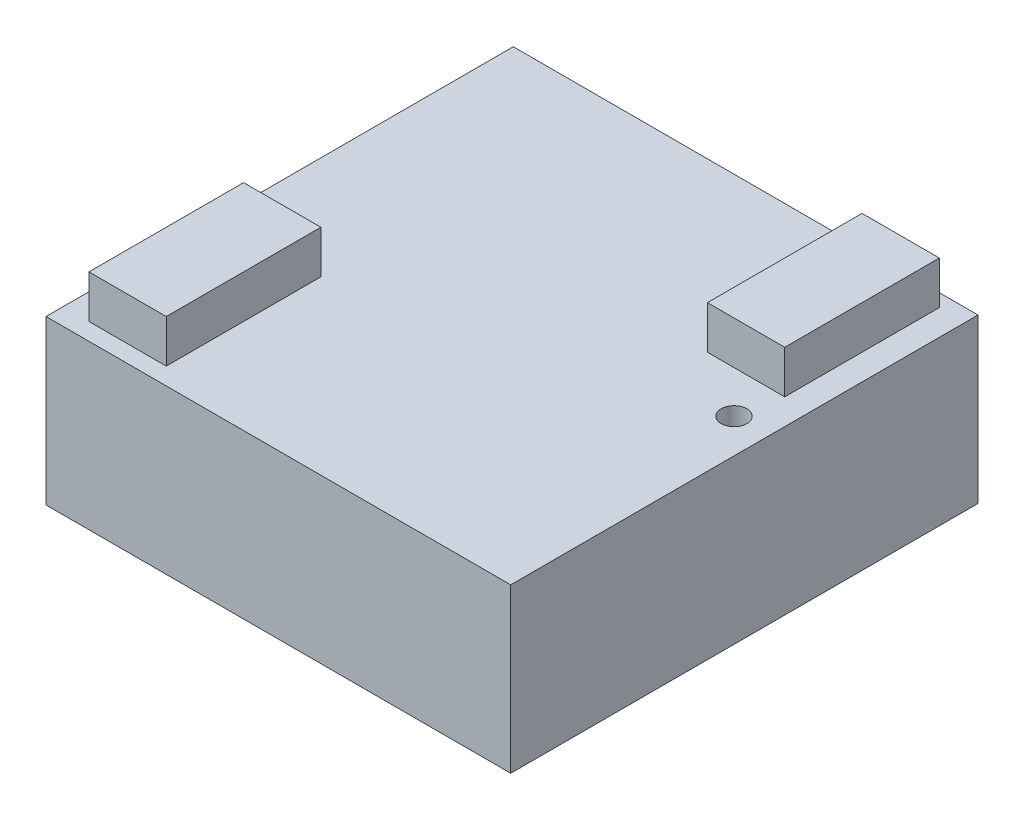
ISO-10303-21;
HEADER;
FILE_DESCRIPTION(('STEP AP214'),'2;1');
FILE_NAME('part.step','',(''),(''),'','','');
FILE_SCHEMA(('AUTOMOTIVE_DESIGN { 1 0 10303 214 1 1 1 1 }'));
ENDSEC;
DATA;
#1=APPLICATION_CONTEXT('core data for automotive mechanical design processes');
#2=APPLICATION_PROTOCOL_DEFINITION('international standard','automotive_design',2000,#1);
#3=PRODUCT_CONTEXT('',#1,'mechanical');
#4=PRODUCT('Part','Part','',(#3));
#5=PRODUCT_RELATED_PRODUCT_CATEGORY('part','',(#4));
#6=PRODUCT_DEFINITION_FORMATION('','',#4);
#7=PRODUCT_DEFINITION_CONTEXT('part definition',#1,'design');
#8=PRODUCT_DEFINITION('design','',#6,#7);
#9=PRODUCT_DEFINITION_SHAPE('','',#8);
#10=(LENGTH_UNIT() NAMED_UNIT(*) SI_UNIT(.MILLI.,.METRE.));
#11=(NAMED_UNIT(*) PLANE_ANGLE_UNIT() SI_UNIT($,.RADIAN.));
#12=(NAMED_UNIT(*) SI_UNIT($,.STERADIAN.) SOLID_ANGLE_UNIT());
#13=UNCERTAINTY_MEASURE_WITH_UNIT(LENGTH_MEASURE(1.E-05),#10,'distance_accuracy_value','');
#14=(GEOMETRIC_REPRESENTATION_CONTEXT(3) GLOBAL_UNCERTAINTY_ASSIGNED_CONTEXT((#13)) GLOBAL_UNIT_ASSIGNED_CONTEXT((#10,
#11,#12)) REPRESENTATION_CONTEXT('',''));
#15=CARTESIAN_POINT('',(0.,0.,0.));
#16=DIRECTION('',(0.,0.,1.));
#17=DIRECTION('',(1.,0.,0.));
#18=AXIS2_PLACEMENT_3D('',#15,#16,#17);
#19=CARTESIAN_POINT('',(0.,19.,0.));
#20=DIRECTION('',(0.,-1.,0.));
#21=DIRECTION('',(0.,0.,-1.));
#22=AXIS2_PLACEMENT_3D('',#19,#20,#21);
#23=PLANE('',#22);
#24=CARTESIAN_POINT('',(50.1,19.,-30.));
#25=DIRECTION('',(0.,-1.,0.));
#26=DIRECTION('',(0.,0.,-1.));
#27=AXIS2_PLACEMENT_3D('',#24,#25,#26);
#28=CIRCLE('',#27,1.5);
#29=CARTESIAN_POINT('',(50.1,19.,-31.5));
#30=VERTEX_POINT('',#29);
#31=EDGE_CURVE('E380',#30,#30,#28,.T.);
#32=ORIENTED_EDGE('',*,*,#31,.T.);
#33=EDGE_LOOP('',(#32));
#34=FACE_BOUND('',#33,.T.);
#35=DIRECTION('',(0.,0.,1.));
#36=VECTOR('',#35,1.);
#37=CARTESIAN_POINT('',(42.1,19.,-52.9));
#38=LINE('',#37,#36);
#39=CARTESIAN_POINT('',(42.1,19.,-52.9));
#40=VERTEX_POINT('',#39);
#41=CARTESIAN_POINT('',(42.1,19.,-34.9));
#42=VERTEX_POINT('',#41);
#43=EDGE_CURVE('E168',#40,#42,#38,.T.);
#44=ORIENTED_EDGE('',*,*,#43,.F.);
#45=DIRECTION('',(-1.,0.,0.));
#46=VECTOR('',#45,1.);
#47=CARTESIAN_POINT('',(42.1,19.,-52.9));
#48=LINE('',#47,#46);
#49=CARTESIAN_POINT('',(51.1,19.,-52.9));
#50=VERTEX_POINT('',#49);
#51=EDGE_CURVE('E181',#50,#40,#48,.T.);
#52=ORIENTED_EDGE('',*,*,#51,.F.);
#53=DIRECTION('',(0.,0.,-1.));
#54=VECTOR('',#53,1.);
#55=CARTESIAN_POINT('',(51.1,19.,-52.9));
#56=LINE('',#55,#54);
#57=CARTESIAN_POINT('',(51.1,19.,-34.9));
#58=VERTEX_POINT('',#57);
#59=EDGE_CURVE('E190',#58,#50,#56,.T.);
#60=ORIENTED_EDGE('',*,*,#59,.F.);
#61=DIRECTION('',(1.,0.,0.));
#62=VECTOR('',#61,1.);
#63=CARTESIAN_POINT('',(42.1,19.,-34.9));
#64=LINE('',#63,#62);
#65=EDGE_CURVE('E171',#42,#58,#64,.T.);
#66=ORIENTED_EDGE('',*,*,#65,.F.);
#67=EDGE_LOOP('',(#44,#52,#60,#66));
#68=FACE_BOUND('',#67,.T.);
#69=DIRECTION('',(0.,0.,1.));
#70=VECTOR('',#69,1.);
#71=CARTESIAN_POINT('',(0.,19.,0.));
#72=LINE('',#71,#70);
#73=CARTESIAN_POINT('',(0.,19.,-54.4));
#74=VERTEX_POINT('',#73);
#75=CARTESIAN_POINT('',(0.,19.,0.));
#76=VERTEX_POINT('',#75);
#77=EDGE_CURVE('E236',#74,#76,#72,.T.);
#78=ORIENTED_EDGE('',*,*,#77,.T.);
#79=DIRECTION('',(1.,0.,0.));
#80=VECTOR('',#79,1.);
#81=CARTESIAN_POINT('',(0.,19.,0.));
#82=LINE('',#81,#80);
#83=CARTESIAN_POINT('',(54.1,19.,0.));
#84=VERTEX_POINT('',#83);
#85=EDGE_CURVE('E239',#76,#84,#82,.T.);
#86=ORIENTED_EDGE('',*,*,#85,.T.);
#87=DIRECTION('',(0.,0.,-1.));
#88=VECTOR('',#87,1.);
#89=CARTESIAN_POINT('',(54.1,19.,0.));
#90=LINE('',#89,#88);
#91=CARTESIAN_POINT('',(54.1,19.,-54.4));
#92=VERTEX_POINT('',#91);
#93=EDGE_CURVE('E242',#84,#92,#90,.T.);
#94=ORIENTED_EDGE('',*,*,#93,.T.);
#95=DIRECTION('',(-1.,0.,0.));
#96=VECTOR('',#95,1.);
#97=CARTESIAN_POINT('',(0.,19.,-54.4));
#98=LINE('',#97,#96);
#99=EDGE_CURVE('E244',#92,#74,#98,.T.);
#100=ORIENTED_EDGE('',*,*,#99,.T.);
#101=EDGE_LOOP('',(#78,#86,#94,#100));
#102=FACE_BOUND('',#101,.T.);
#103=DIRECTION('',(0.,0.,1.));
#104=VECTOR('',#103,1.);
#105=CARTESIAN_POINT('',(3.,19.,-20.));
#106=LINE('',#105,#104);
#107=CARTESIAN_POINT('',(3.,19.,-20.));
#108=VERTEX_POINT('',#107);
#109=CARTESIAN_POINT('',(3.,19.,-2.));
#110=VERTEX_POINT('',#109);
#111=EDGE_CURVE('E167',#108,#110,#106,.T.);
#112=ORIENTED_EDGE('',*,*,#111,.F.);
#113=DIRECTION('',(-1.,0.,0.));
#114=VECTOR('',#113,1.);
#115=CARTESIAN_POINT('',(3.,19.,-20.));
#116=LINE('',#115,#114);
#117=CARTESIAN_POINT('',(12.,19.,-20.));
#118=VERTEX_POINT('',#117);
#119=EDGE_CURVE('E164',#118,#108,#116,.T.);
#120=ORIENTED_EDGE('',*,*,#119,.F.);
#121=DIRECTION('',(0.,0.,-1.));
#122=VECTOR('',#121,1.);
#123=CARTESIAN_POINT('',(12.,19.,-20.));
#124=LINE('',#123,#122);
#125=CARTESIAN_POINT('',(12.,19.,-2.));
#126=VERTEX_POINT('',#125);
#127=EDGE_CURVE('E54',#126,#118,#124,.T.);
#128=ORIENTED_EDGE('',*,*,#127,.F.);
#129=DIRECTION('',(1.,0.,0.));
#130=VECTOR('',#129,1.);
#131=CARTESIAN_POINT('',(3.,19.,-2.));
#132=LINE('',#131,#130);
#133=EDGE_CURVE('E49',#110,#126,#132,.T.);
#134=ORIENTED_EDGE('',*,*,#133,.F.);
#135=EDGE_LOOP('',(#112,#120,#128,#134));
#136=FACE_BOUND('',#135,.T.);
#137=ADVANCED_FACE('F34',(#34,#68,#102,#136),#23,.F.);
#138=CARTESIAN_POINT('',(0.,0.,0.));
#139=DIRECTION('',(0.,-1.,0.));
#140=DIRECTION('',(0.,0.,-1.));
#141=AXIS2_PLACEMENT_3D('',#138,#139,#140);
#142=PLANE('',#141);
#143=CARTESIAN_POINT('',(50.1,0.,-30.));
#144=DIRECTION('',(0.,-1.,0.));
#145=DIRECTION('',(0.,0.,-1.));
#146=AXIS2_PLACEMENT_3D('',#143,#144,#145);
#147=CIRCLE('',#146,1.5);
#148=CARTESIAN_POINT('',(50.1,0.,-31.5));
#149=VERTEX_POINT('',#148);
#150=EDGE_CURVE('E378',#149,#149,#147,.T.);
#151=ORIENTED_EDGE('',*,*,#150,.F.);
#152=EDGE_LOOP('',(#151));
#153=FACE_BOUND('',#152,.T.);
#154=DIRECTION('',(0.,0.,1.));
#155=VECTOR('',#154,1.);
#156=CARTESIAN_POINT('',(0.,0.,0.));
#157=LINE('',#156,#155);
#158=CARTESIAN_POINT('',(0.,0.,-54.4));
#159=VERTEX_POINT('',#158);
#160=CARTESIAN_POINT('',(0.,0.,0.));
#161=VERTEX_POINT('',#160);
#162=EDGE_CURVE('E235',#159,#161,#157,.T.);
#163=ORIENTED_EDGE('',*,*,#162,.F.);
#164=DIRECTION('',(-1.,0.,0.));
#165=VECTOR('',#164,1.);
#166=CARTESIAN_POINT('',(0.,0.,-54.4));
#167=LINE('',#166,#165);
#168=CARTESIAN_POINT('',(54.1,0.,-54.4));
#169=VERTEX_POINT('',#168);
#170=EDGE_CURVE('E240',#169,#159,#167,.T.);
#171=ORIENTED_EDGE('',*,*,#170,.F.);
#172=DIRECTION('',(0.,0.,-1.));
#173=VECTOR('',#172,1.);
#174=CARTESIAN_POINT('',(54.1,0.,0.));
#175=LINE('',#174,#173);
#176=CARTESIAN_POINT('',(54.1,0.,0.));
#177=VERTEX_POINT('',#176);
#178=EDGE_CURVE('E251',#177,#169,#175,.T.);
#179=ORIENTED_EDGE('',*,*,#178,.F.);
#180=DIRECTION('',(1.,0.,0.));
#181=VECTOR('',#180,1.);
#182=CARTESIAN_POINT('',(0.,0.,0.));
#183=LINE('',#182,#181);
#184=EDGE_CURVE('E249',#161,#177,#183,.T.);
#185=ORIENTED_EDGE('',*,*,#184,.F.);
#186=EDGE_LOOP('',(#163,#171,#179,#185));
#187=FACE_BOUND('',#186,.T.);
#188=DIRECTION('',(1.,0.,0.));
#189=VECTOR('',#188,1.);
#190=CARTESIAN_POINT('',(17.,0.,-34.4));
#191=LINE('',#190,#189);
#192=CARTESIAN_POINT('',(17.,0.,-34.4));
#193=VERTEX_POINT('',#192);
#194=CARTESIAN_POINT('',(37.,0.,-34.4));
#195=VERTEX_POINT('',#194);
#196=EDGE_CURVE('E220',#193,#195,#191,.T.);
#197=ORIENTED_EDGE('',*,*,#196,.F.);
#198=DIRECTION('',(0.,0.,-1.));
#199=VECTOR('',#198,1.);
#200=CARTESIAN_POINT('',(17.,0.,-34.4));
#201=LINE('',#200,#199);
#202=CARTESIAN_POINT('',(17.,0.,-22.4));
#203=VERTEX_POINT('',#202);
#204=EDGE_CURVE('E206',#203,#193,#201,.T.);
#205=ORIENTED_EDGE('',*,*,#204,.F.);
#206=DIRECTION('',(-1.,0.,0.));
#207=VECTOR('',#206,1.);
#208=CARTESIAN_POINT('',(17.,0.,-22.4));
#209=LINE('',#208,#207);
#210=CARTESIAN_POINT('',(37.,0.,-22.4));
#211=VERTEX_POINT('',#210);
#212=EDGE_CURVE('E211',#211,#203,#209,.T.);
#213=ORIENTED_EDGE('',*,*,#212,.F.);
#214=DIRECTION('',(0.,0.,1.));
#215=VECTOR('',#214,1.);
#216=CARTESIAN_POINT('',(37.,0.,-34.4));
#217=LINE('',#216,#215);
#218=EDGE_CURVE('E222',#195,#211,#217,.T.);
#219=ORIENTED_EDGE('',*,*,#218,.F.);
#220=EDGE_LOOP('',(#197,#205,#213,#219));
#221=FACE_BOUND('',#220,.T.);
#222=ADVANCED_FACE('F269',(#153,#187,#221),#142,.T.);
#223=CARTESIAN_POINT('',(0.,19.,0.));
#224=DIRECTION('',(1.,0.,0.));
#225=DIRECTION('',(0.,0.,-1.));
#226=AXIS2_PLACEMENT_3D('',#223,#224,#225);
#227=PLANE('',#226);
#228=ORIENTED_EDGE('',*,*,#162,.T.);
#229=DIRECTION('',(0.,-1.,0.));
#230=VECTOR('',#229,1.);
#231=CARTESIAN_POINT('',(0.,19.,0.));
#232=LINE('',#231,#230);
#233=EDGE_CURVE('E11',#76,#161,#232,.T.);
#234=ORIENTED_EDGE('',*,*,#233,.F.);
#235=ORIENTED_EDGE('',*,*,#77,.F.);
#236=DIRECTION('',(0.,-1.,0.));
#237=VECTOR('',#236,1.);
#238=CARTESIAN_POINT('',(0.,19.,-54.4));
#239=LINE('',#238,#237);
#240=EDGE_CURVE('E246',#74,#159,#239,.T.);
#241=ORIENTED_EDGE('',*,*,#240,.T.);
#242=EDGE_LOOP('',(#228,#234,#235,#241));
#243=FACE_BOUND('',#242,.T.);
#244=ADVANCED_FACE('F36',(#243),#227,.F.);
#245=CARTESIAN_POINT('',(0.,19.,0.));
#246=DIRECTION('',(0.,0.,-1.));
#247=DIRECTION('',(-1.,0.,0.));
#248=AXIS2_PLACEMENT_3D('',#245,#246,#247);
#249=PLANE('',#248);
#250=ORIENTED_EDGE('',*,*,#184,.T.);
#251=DIRECTION('',(0.,-1.,0.));
#252=VECTOR('',#251,1.);
#253=CARTESIAN_POINT('',(54.1,19.,0.));
#254=LINE('',#253,#252);
#255=EDGE_CURVE('E42',#84,#177,#254,.T.);
#256=ORIENTED_EDGE('',*,*,#255,.F.);
#257=ORIENTED_EDGE('',*,*,#85,.F.);
#258=ORIENTED_EDGE('',*,*,#233,.T.);
#259=EDGE_LOOP('',(#250,#256,#257,#258));
#260=FACE_BOUND('',#259,.T.);
#261=ADVANCED_FACE('F279',(#260),#249,.F.);
#262=CARTESIAN_POINT('',(54.1,19.,0.));
#263=DIRECTION('',(-1.,0.,0.));
#264=DIRECTION('',(0.,0.,1.));
#265=AXIS2_PLACEMENT_3D('',#262,#263,#264);
#266=PLANE('',#265);
#267=ORIENTED_EDGE('',*,*,#178,.T.);
#268=DIRECTION('',(0.,-1.,0.));
#269=VECTOR('',#268,1.);
#270=CARTESIAN_POINT('',(54.1,19.,-54.4));
#271=LINE('',#270,#269);
#272=EDGE_CURVE('E256',#92,#169,#271,.T.);
#273=ORIENTED_EDGE('',*,*,#272,.F.);
#274=ORIENTED_EDGE('',*,*,#93,.F.);
#275=ORIENTED_EDGE('',*,*,#255,.T.);
#276=EDGE_LOOP('',(#267,#273,#274,#275));
#277=FACE_BOUND('',#276,.T.);
#278=ADVANCED_FACE('F263',(#277),#266,.F.);
#279=CARTESIAN_POINT('',(0.,19.,-54.4));
#280=DIRECTION('',(0.,0.,1.));
#281=DIRECTION('',(1.,0.,0.));
#282=AXIS2_PLACEMENT_3D('',#279,#280,#281);
#283=PLANE('',#282);
#284=ORIENTED_EDGE('',*,*,#170,.T.);
#285=ORIENTED_EDGE('',*,*,#240,.F.);
#286=ORIENTED_EDGE('',*,*,#99,.F.);
#287=ORIENTED_EDGE('',*,*,#272,.T.);
#288=EDGE_LOOP('',(#284,#285,#286,#287));
#289=FACE_BOUND('',#288,.T.);
#290=ADVANCED_FACE('F273',(#289),#283,.F.);
#291=CARTESIAN_POINT('',(17.,-15.,-34.4));
#292=DIRECTION('',(1.,0.,0.));
#293=DIRECTION('',(0.,0.,-1.));
#294=AXIS2_PLACEMENT_3D('',#291,#292,#293);
#295=PLANE('',#294);
#296=ORIENTED_EDGE('',*,*,#204,.T.);
#297=DIRECTION('',(0.,1.,0.));
#298=VECTOR('',#297,1.);
#299=CARTESIAN_POINT('',(17.,-15.,-34.4));
#300=LINE('',#299,#298);
#301=CARTESIAN_POINT('',(17.,-15.,-34.4));
#302=VERTEX_POINT('',#301);
#303=EDGE_CURVE('E233',#302,#193,#300,.T.);
#304=ORIENTED_EDGE('',*,*,#303,.F.);
#305=DIRECTION('',(0.,0.,-1.));
#306=VECTOR('',#305,1.);
#307=CARTESIAN_POINT('',(17.,-15.,-34.4));
#308=LINE('',#307,#306);
#309=CARTESIAN_POINT('',(17.,-15.,-22.4));
#310=VERTEX_POINT('',#309);
#311=EDGE_CURVE('E207',#310,#302,#308,.T.);
#312=ORIENTED_EDGE('',*,*,#311,.F.);
#313=DIRECTION('',(0.,1.,0.));
#314=VECTOR('',#313,1.);
#315=CARTESIAN_POINT('',(17.,-15.,-22.4));
#316=LINE('',#315,#314);
#317=EDGE_CURVE('E217',#310,#203,#316,.T.);
#318=ORIENTED_EDGE('',*,*,#317,.T.);
#319=EDGE_LOOP('',(#296,#304,#312,#318));
#320=FACE_BOUND('',#319,.T.);
#321=ADVANCED_FACE('F297',(#320),#295,.F.);
#322=CARTESIAN_POINT('',(17.,-15.,-34.4));
#323=DIRECTION('',(0.,0.,1.));
#324=DIRECTION('',(1.,0.,0.));
#325=AXIS2_PLACEMENT_3D('',#322,#323,#324);
#326=PLANE('',#325);
#327=ORIENTED_EDGE('',*,*,#196,.T.);
#328=DIRECTION('',(0.,1.,0.));
#329=VECTOR('',#328,1.);
#330=CARTESIAN_POINT('',(37.,-15.,-34.4));
#331=LINE('',#330,#329);
#332=CARTESIAN_POINT('',(37.,-15.,-34.4));
#333=VERTEX_POINT('',#332);
#334=EDGE_CURVE('E230',#333,#195,#331,.T.);
#335=ORIENTED_EDGE('',*,*,#334,.F.);
#336=DIRECTION('',(1.,0.,0.));
#337=VECTOR('',#336,1.);
#338=CARTESIAN_POINT('',(17.,-15.,-34.4));
#339=LINE('',#338,#337);
#340=EDGE_CURVE('E210',#302,#333,#339,.T.);
#341=ORIENTED_EDGE('',*,*,#340,.F.);
#342=ORIENTED_EDGE('',*,*,#303,.T.);
#343=EDGE_LOOP('',(#327,#335,#341,#342));
#344=FACE_BOUND('',#343,.T.);
#345=ADVANCED_FACE('F304',(#344),#326,.F.);
#346=CARTESIAN_POINT('',(37.,-15.,-34.4));
#347=DIRECTION('',(-1.,0.,0.));
#348=DIRECTION('',(0.,0.,1.));
#349=AXIS2_PLACEMENT_3D('',#346,#347,#348);
#350=PLANE('',#349);
#351=ORIENTED_EDGE('',*,*,#218,.T.);
#352=DIRECTION('',(0.,1.,0.));
#353=VECTOR('',#352,1.);
#354=CARTESIAN_POINT('',(37.,-15.,-22.4));
#355=LINE('',#354,#353);
#356=CARTESIAN_POINT('',(37.,-15.,-22.4));
#357=VERTEX_POINT('',#356);
#358=EDGE_CURVE('E228',#357,#211,#355,.T.);
#359=ORIENTED_EDGE('',*,*,#358,.F.);
#360=DIRECTION('',(0.,0.,1.));
#361=VECTOR('',#360,1.);
#362=CARTESIAN_POINT('',(37.,-15.,-34.4));
#363=LINE('',#362,#361);
#364=EDGE_CURVE('E213',#333,#357,#363,.T.);
#365=ORIENTED_EDGE('',*,*,#364,.F.);
#366=ORIENTED_EDGE('',*,*,#334,.T.);
#367=EDGE_LOOP('',(#351,#359,#365,#366));
#368=FACE_BOUND('',#367,.T.);
#369=ADVANCED_FACE('F309',(#368),#350,.F.);
#370=CARTESIAN_POINT('',(17.,-15.,-22.4));
#371=DIRECTION('',(0.,0.,-1.));
#372=DIRECTION('',(-1.,0.,0.));
#373=AXIS2_PLACEMENT_3D('',#370,#371,#372);
#374=PLANE('',#373);
#375=ORIENTED_EDGE('',*,*,#212,.T.);
#376=ORIENTED_EDGE('',*,*,#317,.F.);
#377=DIRECTION('',(-1.,0.,0.));
#378=VECTOR('',#377,1.);
#379=CARTESIAN_POINT('',(17.,-15.,-22.4));
#380=LINE('',#379,#378);
#381=EDGE_CURVE('E215',#357,#310,#380,.T.);
#382=ORIENTED_EDGE('',*,*,#381,.F.);
#383=ORIENTED_EDGE('',*,*,#358,.T.);
#384=EDGE_LOOP('',(#375,#376,#382,#383));
#385=FACE_BOUND('',#384,.T.);
#386=ADVANCED_FACE('F326',(#385),#374,.F.);
#387=CARTESIAN_POINT('',(0.,-15.,0.));
#388=DIRECTION('',(0.,1.,0.));
#389=DIRECTION('',(0.,0.,1.));
#390=AXIS2_PLACEMENT_3D('',#387,#388,#389);
#391=PLANE('',#390);
#392=ORIENTED_EDGE('',*,*,#311,.T.);
#393=ORIENTED_EDGE('',*,*,#340,.T.);
#394=ORIENTED_EDGE('',*,*,#364,.T.);
#395=ORIENTED_EDGE('',*,*,#381,.T.);
#396=EDGE_LOOP('',(#392,#393,#394,#395));
#397=FACE_BOUND('',#396,.T.);
#398=ADVANCED_FACE('F324',(#397),#391,.F.);
#399=CARTESIAN_POINT('',(42.1,24.,-52.9));
#400=DIRECTION('',(1.,0.,0.));
#401=DIRECTION('',(0.,0.,-1.));
#402=AXIS2_PLACEMENT_3D('',#399,#400,#401);
#403=PLANE('',#402);
#404=ORIENTED_EDGE('',*,*,#43,.T.);
#405=DIRECTION('',(0.,-1.,0.));
#406=VECTOR('',#405,1.);
#407=CARTESIAN_POINT('',(42.1,24.,-34.9));
#408=LINE('',#407,#406);
#409=CARTESIAN_POINT('',(42.1,24.,-34.9));
#410=VERTEX_POINT('',#409);
#411=EDGE_CURVE('E203',#410,#42,#408,.T.);
#412=ORIENTED_EDGE('',*,*,#411,.F.);
#413=DIRECTION('',(0.,0.,1.));
#414=VECTOR('',#413,1.);
#415=CARTESIAN_POINT('',(42.1,24.,-52.9));
#416=LINE('',#415,#414);
#417=CARTESIAN_POINT('',(42.1,24.,-52.9));
#418=VERTEX_POINT('',#417);
#419=EDGE_CURVE('E177',#418,#410,#416,.T.);
#420=ORIENTED_EDGE('',*,*,#419,.F.);
#421=DIRECTION('',(0.,-1.,0.));
#422=VECTOR('',#421,1.);
#423=CARTESIAN_POINT('',(42.1,24.,-52.9));
#424=LINE('',#423,#422);
#425=EDGE_CURVE('E186',#418,#40,#424,.T.);
#426=ORIENTED_EDGE('',*,*,#425,.T.);
#427=EDGE_LOOP('',(#404,#412,#420,#426));
#428=FACE_BOUND('',#427,.T.);
#429=ADVANCED_FACE('F333',(#428),#403,.F.);
#430=CARTESIAN_POINT('',(42.1,24.,-34.9));
#431=DIRECTION('',(0.,0.,-1.));
#432=DIRECTION('',(-1.,0.,0.));
#433=AXIS2_PLACEMENT_3D('',#430,#431,#432);
#434=PLANE('',#433);
#435=ORIENTED_EDGE('',*,*,#65,.T.);
#436=DIRECTION('',(0.,-1.,0.));
#437=VECTOR('',#436,1.);
#438=CARTESIAN_POINT('',(51.1,24.,-34.9));
#439=LINE('',#438,#437);
#440=CARTESIAN_POINT('',(51.1,24.,-34.9));
#441=VERTEX_POINT('',#440);
#442=EDGE_CURVE('E200',#441,#58,#439,.T.);
#443=ORIENTED_EDGE('',*,*,#442,.F.);
#444=DIRECTION('',(1.,0.,0.));
#445=VECTOR('',#444,1.);
#446=CARTESIAN_POINT('',(42.1,24.,-34.9));
#447=LINE('',#446,#445);
#448=EDGE_CURVE('E180',#410,#441,#447,.T.);
#449=ORIENTED_EDGE('',*,*,#448,.F.);
#450=ORIENTED_EDGE('',*,*,#411,.T.);
#451=EDGE_LOOP('',(#435,#443,#449,#450));
#452=FACE_BOUND('',#451,.T.);
#453=ADVANCED_FACE('F339',(#452),#434,.F.);
#454=CARTESIAN_POINT('',(51.1,24.,-52.9));
#455=DIRECTION('',(-1.,0.,0.));
#456=DIRECTION('',(0.,0.,1.));
#457=AXIS2_PLACEMENT_3D('',#454,#455,#456);
#458=PLANE('',#457);
#459=ORIENTED_EDGE('',*,*,#59,.T.);
#460=DIRECTION('',(0.,-1.,0.));
#461=VECTOR('',#460,1.);
#462=CARTESIAN_POINT('',(51.1,24.,-52.9));
#463=LINE('',#462,#461);
#464=CARTESIAN_POINT('',(51.1,24.,-52.9));
#465=VERTEX_POINT('',#464);
#466=EDGE_CURVE('E197',#465,#50,#463,.T.);
#467=ORIENTED_EDGE('',*,*,#466,.F.);
#468=DIRECTION('',(0.,0.,-1.));
#469=VECTOR('',#468,1.);
#470=CARTESIAN_POINT('',(51.1,24.,-52.9));
#471=LINE('',#470,#469);
#472=EDGE_CURVE('E183',#441,#465,#471,.T.);
#473=ORIENTED_EDGE('',*,*,#472,.F.);
#474=ORIENTED_EDGE('',*,*,#442,.T.);
#475=EDGE_LOOP('',(#459,#467,#473,#474));
#476=FACE_BOUND('',#475,.T.);
#477=ADVANCED_FACE('F343',(#476),#458,.F.);
#478=CARTESIAN_POINT('',(42.1,24.,-52.9));
#479=DIRECTION('',(0.,0.,1.));
#480=DIRECTION('',(1.,0.,0.));
#481=AXIS2_PLACEMENT_3D('',#478,#479,#480);
#482=PLANE('',#481);
#483=ORIENTED_EDGE('',*,*,#51,.T.);
#484=ORIENTED_EDGE('',*,*,#425,.F.);
#485=DIRECTION('',(-1.,0.,0.));
#486=VECTOR('',#485,1.);
#487=CARTESIAN_POINT('',(42.1,24.,-52.9));
#488=LINE('',#487,#486);
#489=EDGE_CURVE('E185',#465,#418,#488,.T.);
#490=ORIENTED_EDGE('',*,*,#489,.F.);
#491=ORIENTED_EDGE('',*,*,#466,.T.);
#492=EDGE_LOOP('',(#483,#484,#490,#491));
#493=FACE_BOUND('',#492,.T.);
#494=ADVANCED_FACE('F347',(#493),#482,.F.);
#495=CARTESIAN_POINT('',(0.,24.,0.));
#496=DIRECTION('',(0.,1.,0.));
#497=DIRECTION('',(0.,0.,1.));
#498=AXIS2_PLACEMENT_3D('',#495,#496,#497);
#499=PLANE('',#498);
#500=ORIENTED_EDGE('',*,*,#419,.T.);
#501=ORIENTED_EDGE('',*,*,#448,.T.);
#502=ORIENTED_EDGE('',*,*,#472,.T.);
#503=ORIENTED_EDGE('',*,*,#489,.T.);
#504=EDGE_LOOP('',(#500,#501,#502,#503));
#505=FACE_BOUND('',#504,.T.);
#506=ADVANCED_FACE('F351',(#505),#499,.T.);
#507=CARTESIAN_POINT('',(3.,24.,-20.));
#508=DIRECTION('',(1.,0.,0.));
#509=DIRECTION('',(0.,0.,-1.));
#510=AXIS2_PLACEMENT_3D('',#507,#508,#509);
#511=PLANE('',#510);
#512=ORIENTED_EDGE('',*,*,#111,.T.);
#513=DIRECTION('',(0.,-1.,0.));
#514=VECTOR('',#513,1.);
#515=CARTESIAN_POINT('',(3.,24.,-2.));
#516=LINE('',#515,#514);
#517=CARTESIAN_POINT('',(3.,24.,-2.));
#518=VERTEX_POINT('',#517);
#519=EDGE_CURVE('E148',#518,#110,#516,.T.);
#520=ORIENTED_EDGE('',*,*,#519,.F.);
#521=DIRECTION('',(0.,0.,1.));
#522=VECTOR('',#521,1.);
#523=CARTESIAN_POINT('',(3.,24.,-20.));
#524=LINE('',#523,#522);
#525=CARTESIAN_POINT('',(3.,24.,-20.));
#526=VERTEX_POINT('',#525);
#527=EDGE_CURVE('E155',#526,#518,#524,.T.);
#528=ORIENTED_EDGE('',*,*,#527,.F.);
#529=DIRECTION('',(0.,-1.,0.));
#530=VECTOR('',#529,1.);
#531=CARTESIAN_POINT('',(3.,24.,-20.));
#532=LINE('',#531,#530);
#533=EDGE_CURVE('E386',#526,#108,#532,.T.);
#534=ORIENTED_EDGE('',*,*,#533,.T.);
#535=EDGE_LOOP('',(#512,#520,#528,#534));
#536=FACE_BOUND('',#535,.T.);
#537=ADVANCED_FACE('F166',(#536),#511,.F.);
#538=CARTESIAN_POINT('',(3.,24.,-2.));
#539=DIRECTION('',(0.,0.,-1.));
#540=DIRECTION('',(-1.,0.,0.));
#541=AXIS2_PLACEMENT_3D('',#538,#539,#540);
#542=PLANE('',#541);
#543=ORIENTED_EDGE('',*,*,#133,.T.);
#544=DIRECTION('',(0.,-1.,0.));
#545=VECTOR('',#544,1.);
#546=CARTESIAN_POINT('',(12.,24.,-2.));
#547=LINE('',#546,#545);
#548=CARTESIAN_POINT('',(12.,24.,-2.));
#549=VERTEX_POINT('',#548);
#550=EDGE_CURVE('E151',#549,#126,#547,.T.);
#551=ORIENTED_EDGE('',*,*,#550,.F.);
#552=DIRECTION('',(1.,0.,0.));
#553=VECTOR('',#552,1.);
#554=CARTESIAN_POINT('',(3.,24.,-2.));
#555=LINE('',#554,#553);
#556=EDGE_CURVE('E144',#518,#549,#555,.T.);
#557=ORIENTED_EDGE('',*,*,#556,.F.);
#558=ORIENTED_EDGE('',*,*,#519,.T.);
#559=EDGE_LOOP('',(#543,#551,#557,#558));
#560=FACE_BOUND('',#559,.T.);
#561=ADVANCED_FACE('F146',(#560),#542,.F.);
#562=CARTESIAN_POINT('',(12.,24.,-20.));
#563=DIRECTION('',(-1.,0.,0.));
#564=DIRECTION('',(0.,0.,1.));
#565=AXIS2_PLACEMENT_3D('',#562,#563,#564);
#566=PLANE('',#565);
#567=ORIENTED_EDGE('',*,*,#127,.T.);
#568=DIRECTION('',(0.,-1.,0.));
#569=VECTOR('',#568,1.);
#570=CARTESIAN_POINT('',(12.,24.,-20.));
#571=LINE('',#570,#569);
#572=CARTESIAN_POINT('',(12.,24.,-20.));
#573=VERTEX_POINT('',#572);
#574=EDGE_CURVE('E173',#573,#118,#571,.T.);
#575=ORIENTED_EDGE('',*,*,#574,.F.);
#576=DIRECTION('',(0.,0.,-1.));
#577=VECTOR('',#576,1.);
#578=CARTESIAN_POINT('',(12.,24.,-20.));
#579=LINE('',#578,#577);
#580=EDGE_CURVE('E154',#549,#573,#579,.T.);
#581=ORIENTED_EDGE('',*,*,#580,.F.);
#582=ORIENTED_EDGE('',*,*,#550,.T.);
#583=EDGE_LOOP('',(#567,#575,#581,#582));
#584=FACE_BOUND('',#583,.T.);
#585=ADVANCED_FACE('F360',(#584),#566,.F.);
#586=CARTESIAN_POINT('',(3.,24.,-20.));
#587=DIRECTION('',(0.,0.,1.));
#588=DIRECTION('',(1.,0.,0.));
#589=AXIS2_PLACEMENT_3D('',#586,#587,#588);
#590=PLANE('',#589);
#591=ORIENTED_EDGE('',*,*,#119,.T.);
#592=ORIENTED_EDGE('',*,*,#533,.F.);
#593=DIRECTION('',(-1.,0.,0.));
#594=VECTOR('',#593,1.);
#595=CARTESIAN_POINT('',(3.,24.,-20.));
#596=LINE('',#595,#594);
#597=EDGE_CURVE('E160',#573,#526,#596,.T.);
#598=ORIENTED_EDGE('',*,*,#597,.F.);
#599=ORIENTED_EDGE('',*,*,#574,.T.);
#600=EDGE_LOOP('',(#591,#592,#598,#599));
#601=FACE_BOUND('',#600,.T.);
#602=ADVANCED_FACE('F363',(#601),#590,.F.);
#603=CARTESIAN_POINT('',(0.,24.,0.));
#604=DIRECTION('',(0.,1.,0.));
#605=DIRECTION('',(0.,0.,1.));
#606=AXIS2_PLACEMENT_3D('',#603,#604,#605);
#607=PLANE('',#606);
#608=ORIENTED_EDGE('',*,*,#527,.T.);
#609=ORIENTED_EDGE('',*,*,#556,.T.);
#610=ORIENTED_EDGE('',*,*,#580,.T.);
#611=ORIENTED_EDGE('',*,*,#597,.T.);
#612=EDGE_LOOP('',(#608,#609,#610,#611));
#613=FACE_BOUND('',#612,.T.);
#614=ADVANCED_FACE('F158',(#613),#607,.T.);
#615=CARTESIAN_POINT('',(50.1,24.,-30.));
#616=DIRECTION('',(0.,-1.,0.));
#617=DIRECTION('',(0.,0.,-1.));
#618=AXIS2_PLACEMENT_3D('',#615,#616,#617);
#619=CYLINDRICAL_SURFACE('',#618,1.5);
#620=ORIENTED_EDGE('',*,*,#150,.T.);
#621=EDGE_LOOP('',(#620));
#622=FACE_BOUND('',#621,.T.);
#623=ORIENTED_EDGE('',*,*,#31,.F.);
#624=EDGE_LOOP('',(#623));
#625=FACE_BOUND('',#624,.T.);
#626=ADVANCED_FACE('F370',(#622,#625),#619,.F.);
#627=CLOSED_SHELL('',(#137,#222,#244,#261,#278,#290,#321,#345,#369,#386,#398,#429,#453,#477,
#494,#506,#537,#561,#585,#602,#614,#626));
#628=MANIFOLD_SOLID_BREP('B2',#627);
#629=ADVANCED_BREP_SHAPE_REPRESENTATION('',(#18,#628),#14);
#630=SHAPE_DEFINITION_REPRESENTATION(#9,#629);
ENDSEC;
END-ISO-10303-21;
